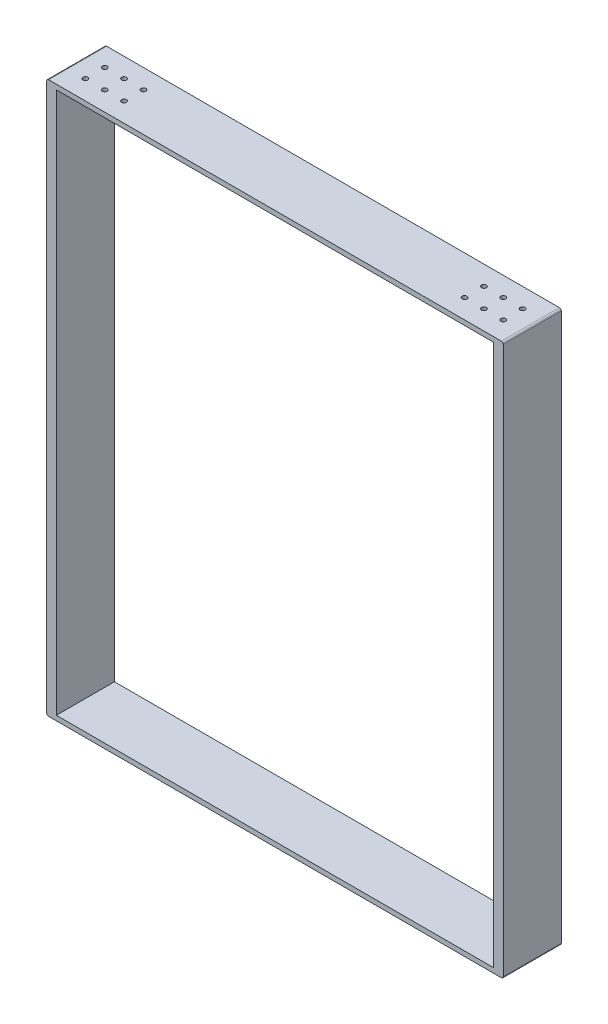
ISO-10303-21;
HEADER;
FILE_DESCRIPTION(('STEP AP214'),'2;1');
FILE_NAME('part.step','',(''),(''),'','','');
FILE_SCHEMA(('AUTOMOTIVE_DESIGN { 1 0 10303 214 1 1 1 1 }'));
ENDSEC;
DATA;
#1=APPLICATION_CONTEXT('core data for automotive mechanical design processes');
#2=APPLICATION_PROTOCOL_DEFINITION('international standard','automotive_design',2000,#1);
#3=PRODUCT_CONTEXT('',#1,'mechanical');
#4=PRODUCT('Part','Part','',(#3));
#5=PRODUCT_RELATED_PRODUCT_CATEGORY('part','',(#4));
#6=PRODUCT_DEFINITION_FORMATION('','',#4);
#7=PRODUCT_DEFINITION_CONTEXT('part definition',#1,'design');
#8=PRODUCT_DEFINITION('design','',#6,#7);
#9=PRODUCT_DEFINITION_SHAPE('','',#8);
#10=(LENGTH_UNIT() NAMED_UNIT(*) SI_UNIT(.MILLI.,.METRE.));
#11=(NAMED_UNIT(*) PLANE_ANGLE_UNIT() SI_UNIT($,.RADIAN.));
#12=(NAMED_UNIT(*) SI_UNIT($,.STERADIAN.) SOLID_ANGLE_UNIT());
#13=UNCERTAINTY_MEASURE_WITH_UNIT(LENGTH_MEASURE(1.E-05),#10,'distance_accuracy_value','');
#14=(GEOMETRIC_REPRESENTATION_CONTEXT(3) GLOBAL_UNCERTAINTY_ASSIGNED_CONTEXT((#13)) GLOBAL_UNIT_ASSIGNED_CONTEXT((#10,
#11,#12)) REPRESENTATION_CONTEXT('',''));
#15=CARTESIAN_POINT('',(0.,0.,0.));
#16=DIRECTION('',(0.,0.,1.));
#17=DIRECTION('',(1.,0.,0.));
#18=AXIS2_PLACEMENT_3D('',#15,#16,#17);
#19=CARTESIAN_POINT('',(0.,0.,76.2));
#20=DIRECTION('',(0.,0.,1.));
#21=DIRECTION('',(1.,0.,0.));
#22=AXIS2_PLACEMENT_3D('',#19,#20,#21);
#23=PLANE('',#22);
#24=DIRECTION('',(0.,-1.,0.));
#25=VECTOR('',#24,1.);
#26=CARTESIAN_POINT('',(-299.72,361.95,76.2));
#27=LINE('',#26,#25);
#28=CARTESIAN_POINT('',(-299.72,359.41,76.2));
#29=VERTEX_POINT('',#28);
#30=CARTESIAN_POINT('',(-299.72,-359.41,76.2));
#31=VERTEX_POINT('',#30);
#32=EDGE_CURVE('E198',#29,#31,#27,.T.);
#33=ORIENTED_EDGE('',*,*,#32,.T.);
#34=CARTESIAN_POINT('',(-297.18,-359.41,76.2));
#35=DIRECTION('',(0.,0.,1.));
#36=DIRECTION('',(1.,0.,0.));
#37=AXIS2_PLACEMENT_3D('',#34,#35,#36);
#38=CIRCLE('',#37,2.54);
#39=CARTESIAN_POINT('',(-297.18,-361.95,76.2));
#40=VERTEX_POINT('',#39);
#41=EDGE_CURVE('E249',#31,#40,#38,.T.);
#42=ORIENTED_EDGE('',*,*,#41,.T.);
#43=DIRECTION('',(1.,0.,0.));
#44=VECTOR('',#43,1.);
#45=CARTESIAN_POINT('',(-299.72,-361.95,76.2));
#46=LINE('',#45,#44);
#47=CARTESIAN_POINT('',(297.18,-361.95,76.2));
#48=VERTEX_POINT('',#47);
#49=EDGE_CURVE('E187',#40,#48,#46,.T.);
#50=ORIENTED_EDGE('',*,*,#49,.T.);
#51=CARTESIAN_POINT('',(297.18,-359.41,76.2));
#52=DIRECTION('',(0.,0.,1.));
#53=DIRECTION('',(1.,0.,0.));
#54=AXIS2_PLACEMENT_3D('',#51,#52,#53);
#55=CIRCLE('',#54,2.54);
#56=CARTESIAN_POINT('',(299.72,-359.41,76.2));
#57=VERTEX_POINT('',#56);
#58=EDGE_CURVE('E246',#48,#57,#55,.T.);
#59=ORIENTED_EDGE('',*,*,#58,.T.);
#60=DIRECTION('',(0.,1.,0.));
#61=VECTOR('',#60,1.);
#62=CARTESIAN_POINT('',(299.72,-361.95,76.2));
#63=LINE('',#62,#61);
#64=CARTESIAN_POINT('',(299.72,359.41,76.2));
#65=VERTEX_POINT('',#64);
#66=EDGE_CURVE('E191',#57,#65,#63,.T.);
#67=ORIENTED_EDGE('',*,*,#66,.T.);
#68=CARTESIAN_POINT('',(297.18,359.41,76.2));
#69=DIRECTION('',(0.,0.,1.));
#70=DIRECTION('',(1.,0.,0.));
#71=AXIS2_PLACEMENT_3D('',#68,#69,#70);
#72=CIRCLE('',#71,2.54);
#73=CARTESIAN_POINT('',(297.18,361.95,76.2));
#74=VERTEX_POINT('',#73);
#75=EDGE_CURVE('E62',#65,#74,#72,.T.);
#76=ORIENTED_EDGE('',*,*,#75,.T.);
#77=DIRECTION('',(-1.,0.,0.));
#78=VECTOR('',#77,1.);
#79=CARTESIAN_POINT('',(299.72,361.95,76.2));
#80=LINE('',#79,#78);
#81=CARTESIAN_POINT('',(-297.18,361.95,76.2));
#82=VERTEX_POINT('',#81);
#83=EDGE_CURVE('E195',#74,#82,#80,.T.);
#84=ORIENTED_EDGE('',*,*,#83,.T.);
#85=CARTESIAN_POINT('',(-297.18,359.41,76.2));
#86=DIRECTION('',(0.,0.,1.));
#87=DIRECTION('',(1.,0.,0.));
#88=AXIS2_PLACEMENT_3D('',#85,#86,#87);
#89=CIRCLE('',#88,2.54);
#90=EDGE_CURVE('E241',#82,#29,#89,.T.);
#91=ORIENTED_EDGE('',*,*,#90,.T.);
#92=EDGE_LOOP('',(#33,#42,#50,#59,#67,#76,#84,#91));
#93=FACE_BOUND('',#92,.T.);
#94=DIRECTION('',(0.,-1.,0.));
#95=VECTOR('',#94,1.);
#96=CARTESIAN_POINT('',(-287.02,355.6,76.2));
#97=LINE('',#96,#95);
#98=CARTESIAN_POINT('',(-287.02,355.6,76.2));
#99=VERTEX_POINT('',#98);
#100=CARTESIAN_POINT('',(-287.02,-355.6,76.2));
#101=VERTEX_POINT('',#100);
#102=EDGE_CURVE('E143',#99,#101,#97,.T.);
#103=ORIENTED_EDGE('',*,*,#102,.F.);
#104=DIRECTION('',(-1.,0.,0.));
#105=VECTOR('',#104,1.);
#106=CARTESIAN_POINT('',(287.02,355.6,76.2));
#107=LINE('',#106,#105);
#108=CARTESIAN_POINT('',(287.02,355.6,76.2));
#109=VERTEX_POINT('',#108);
#110=EDGE_CURVE('E132',#109,#99,#107,.T.);
#111=ORIENTED_EDGE('',*,*,#110,.F.);
#112=DIRECTION('',(0.,1.,0.));
#113=VECTOR('',#112,1.);
#114=CARTESIAN_POINT('',(287.02,-355.6,76.2));
#115=LINE('',#114,#113);
#116=CARTESIAN_POINT('',(287.02,-355.6,76.2));
#117=VERTEX_POINT('',#116);
#118=EDGE_CURVE('E161',#117,#109,#115,.T.);
#119=ORIENTED_EDGE('',*,*,#118,.F.);
#120=DIRECTION('',(1.,0.,0.));
#121=VECTOR('',#120,1.);
#122=CARTESIAN_POINT('',(-287.02,-355.6,76.2));
#123=LINE('',#122,#121);
#124=EDGE_CURVE('E157',#101,#117,#123,.T.);
#125=ORIENTED_EDGE('',*,*,#124,.F.);
#126=EDGE_LOOP('',(#103,#111,#119,#125));
#127=FACE_BOUND('',#126,.T.);
#128=ADVANCED_FACE('F40',(#93,#127),#23,.T.);
#129=CARTESIAN_POINT('',(0.,0.,0.));
#130=DIRECTION('',(0.,0.,1.));
#131=DIRECTION('',(1.,0.,0.));
#132=AXIS2_PLACEMENT_3D('',#129,#130,#131);
#133=PLANE('',#132);
#134=DIRECTION('',(1.,0.,0.));
#135=VECTOR('',#134,1.);
#136=CARTESIAN_POINT('',(-299.72,-361.95,0.));
#137=LINE('',#136,#135);
#138=CARTESIAN_POINT('',(-297.18,-361.95,0.));
#139=VERTEX_POINT('',#138);
#140=CARTESIAN_POINT('',(297.18,-361.95,0.));
#141=VERTEX_POINT('',#140);
#142=EDGE_CURVE('E152',#139,#141,#137,.T.);
#143=ORIENTED_EDGE('',*,*,#142,.F.);
#144=CARTESIAN_POINT('',(-297.18,-359.41,0.));
#145=DIRECTION('',(0.,0.,1.));
#146=DIRECTION('',(1.,0.,0.));
#147=AXIS2_PLACEMENT_3D('',#144,#145,#146);
#148=CIRCLE('',#147,2.54);
#149=CARTESIAN_POINT('',(-299.72,-359.41,0.));
#150=VERTEX_POINT('',#149);
#151=EDGE_CURVE('E231',#139,#150,#148,.F.);
#152=ORIENTED_EDGE('',*,*,#151,.T.);
#153=DIRECTION('',(0.,-1.,0.));
#154=VECTOR('',#153,1.);
#155=CARTESIAN_POINT('',(-299.72,361.95,0.));
#156=LINE('',#155,#154);
#157=CARTESIAN_POINT('',(-299.72,359.41,0.));
#158=VERTEX_POINT('',#157);
#159=EDGE_CURVE('E192',#158,#150,#156,.T.);
#160=ORIENTED_EDGE('',*,*,#159,.F.);
#161=CARTESIAN_POINT('',(-297.18,359.41,0.));
#162=DIRECTION('',(0.,0.,1.));
#163=DIRECTION('',(1.,0.,0.));
#164=AXIS2_PLACEMENT_3D('',#161,#162,#163);
#165=CIRCLE('',#164,2.54);
#166=CARTESIAN_POINT('',(-297.18,361.95,0.));
#167=VERTEX_POINT('',#166);
#168=EDGE_CURVE('E222',#158,#167,#165,.F.);
#169=ORIENTED_EDGE('',*,*,#168,.T.);
#170=DIRECTION('',(-1.,0.,0.));
#171=VECTOR('',#170,1.);
#172=CARTESIAN_POINT('',(299.72,361.95,0.));
#173=LINE('',#172,#171);
#174=CARTESIAN_POINT('',(297.18,361.95,0.));
#175=VERTEX_POINT('',#174);
#176=EDGE_CURVE('E210',#175,#167,#173,.T.);
#177=ORIENTED_EDGE('',*,*,#176,.F.);
#178=CARTESIAN_POINT('',(297.18,359.41,0.));
#179=DIRECTION('',(0.,0.,1.));
#180=DIRECTION('',(1.,0.,0.));
#181=AXIS2_PLACEMENT_3D('',#178,#179,#180);
#182=CIRCLE('',#181,2.54);
#183=CARTESIAN_POINT('',(299.72,359.41,0.));
#184=VERTEX_POINT('',#183);
#185=EDGE_CURVE('E225',#175,#184,#182,.F.);
#186=ORIENTED_EDGE('',*,*,#185,.T.);
#187=DIRECTION('',(0.,1.,0.));
#188=VECTOR('',#187,1.);
#189=CARTESIAN_POINT('',(299.72,-361.95,0.));
#190=LINE('',#189,#188);
#191=CARTESIAN_POINT('',(299.72,-359.41,0.));
#192=VERTEX_POINT('',#191);
#193=EDGE_CURVE('E206',#192,#184,#190,.T.);
#194=ORIENTED_EDGE('',*,*,#193,.F.);
#195=CARTESIAN_POINT('',(297.18,-359.41,0.));
#196=DIRECTION('',(0.,0.,1.));
#197=DIRECTION('',(1.,0.,0.));
#198=AXIS2_PLACEMENT_3D('',#195,#196,#197);
#199=CIRCLE('',#198,2.54);
#200=EDGE_CURVE('E228',#192,#141,#199,.F.);
#201=ORIENTED_EDGE('',*,*,#200,.T.);
#202=EDGE_LOOP('',(#143,#152,#160,#169,#177,#186,#194,#201));
#203=FACE_BOUND('',#202,.T.);
#204=DIRECTION('',(-1.,0.,0.));
#205=VECTOR('',#204,1.);
#206=CARTESIAN_POINT('',(287.02,355.6,0.));
#207=LINE('',#206,#205);
#208=CARTESIAN_POINT('',(287.02,355.6,0.));
#209=VERTEX_POINT('',#208);
#210=CARTESIAN_POINT('',(-287.02,355.6,0.));
#211=VERTEX_POINT('',#210);
#212=EDGE_CURVE('E167',#209,#211,#207,.T.);
#213=ORIENTED_EDGE('',*,*,#212,.T.);
#214=DIRECTION('',(0.,-1.,0.));
#215=VECTOR('',#214,1.);
#216=CARTESIAN_POINT('',(-287.02,355.6,0.));
#217=LINE('',#216,#215);
#218=CARTESIAN_POINT('',(-287.02,-355.6,0.));
#219=VERTEX_POINT('',#218);
#220=EDGE_CURVE('E150',#211,#219,#217,.T.);
#221=ORIENTED_EDGE('',*,*,#220,.T.);
#222=DIRECTION('',(1.,0.,0.));
#223=VECTOR('',#222,1.);
#224=CARTESIAN_POINT('',(-287.02,-355.6,0.));
#225=LINE('',#224,#223);
#226=CARTESIAN_POINT('',(287.02,-355.6,0.));
#227=VERTEX_POINT('',#226);
#228=EDGE_CURVE('E173',#219,#227,#225,.T.);
#229=ORIENTED_EDGE('',*,*,#228,.T.);
#230=DIRECTION('',(0.,1.,0.));
#231=VECTOR('',#230,1.);
#232=CARTESIAN_POINT('',(287.02,-355.6,0.));
#233=LINE('',#232,#231);
#234=EDGE_CURVE('E144',#227,#209,#233,.T.);
#235=ORIENTED_EDGE('',*,*,#234,.T.);
#236=EDGE_LOOP('',(#213,#221,#229,#235));
#237=FACE_BOUND('',#236,.T.);
#238=ADVANCED_FACE('F269',(#203,#237),#133,.F.);
#239=CARTESIAN_POINT('',(-299.72,-361.95,76.2));
#240=DIRECTION('',(0.,1.,0.));
#241=DIRECTION('',(-1.,0.,0.));
#242=AXIS2_PLACEMENT_3D('',#239,#240,#241);
#243=PLANE('',#242);
#244=ORIENTED_EDGE('',*,*,#49,.F.);
#245=DIRECTION('',(0.,0.,-1.));
#246=VECTOR('',#245,1.);
#247=CARTESIAN_POINT('',(-297.18,-361.95,76.2));
#248=LINE('',#247,#246);
#249=EDGE_CURVE('E218',#40,#139,#248,.T.);
#250=ORIENTED_EDGE('',*,*,#249,.T.);
#251=ORIENTED_EDGE('',*,*,#142,.T.);
#252=DIRECTION('',(0.,0.,-1.));
#253=VECTOR('',#252,1.);
#254=CARTESIAN_POINT('',(297.18,-361.95,76.2));
#255=LINE('',#254,#253);
#256=EDGE_CURVE('E202',#141,#48,#255,.F.);
#257=ORIENTED_EDGE('',*,*,#256,.T.);
#258=EDGE_LOOP('',(#244,#250,#251,#257));
#259=FACE_BOUND('',#258,.T.);
#260=ADVANCED_FACE('F290',(#259),#243,.F.);
#261=CARTESIAN_POINT('',(299.72,-361.95,76.2));
#262=DIRECTION('',(-1.,0.,0.));
#263=DIRECTION('',(0.,0.,1.));
#264=AXIS2_PLACEMENT_3D('',#261,#262,#263);
#265=PLANE('',#264);
#266=ORIENTED_EDGE('',*,*,#66,.F.);
#267=DIRECTION('',(0.,0.,-1.));
#268=VECTOR('',#267,1.);
#269=CARTESIAN_POINT('',(299.72,-359.41,76.2));
#270=LINE('',#269,#268);
#271=EDGE_CURVE('E255',#57,#192,#270,.T.);
#272=ORIENTED_EDGE('',*,*,#271,.T.);
#273=ORIENTED_EDGE('',*,*,#193,.T.);
#274=DIRECTION('',(0.,0.,-1.));
#275=VECTOR('',#274,1.);
#276=CARTESIAN_POINT('',(299.72,359.41,76.2));
#277=LINE('',#276,#275);
#278=EDGE_CURVE('E252',#184,#65,#277,.F.);
#279=ORIENTED_EDGE('',*,*,#278,.T.);
#280=EDGE_LOOP('',(#266,#272,#273,#279));
#281=FACE_BOUND('',#280,.T.);
#282=ADVANCED_FACE('F263',(#281),#265,.F.);
#283=CARTESIAN_POINT('',(299.72,361.95,76.2));
#284=DIRECTION('',(0.,-1.,0.));
#285=DIRECTION('',(0.,0.,-1.));
#286=AXIS2_PLACEMENT_3D('',#283,#284,#285);
#287=PLANE('',#286);
#288=CARTESIAN_POINT('',(223.52,361.95,50.8));
#289=DIRECTION('',(0.,-1.,0.));
#290=DIRECTION('',(0.,0.,1.));
#291=AXIS2_PLACEMENT_3D('',#288,#289,#290);
#292=CIRCLE('',#291,3.17499999999997);
#293=CARTESIAN_POINT('',(223.52,361.95,53.975));
#294=VERTEX_POINT('',#293);
#295=EDGE_CURVE('E535',#294,#294,#292,.T.);
#296=ORIENTED_EDGE('',*,*,#295,.T.);
#297=EDGE_LOOP('',(#296));
#298=FACE_BOUND('',#297,.T.);
#299=CARTESIAN_POINT('',(248.92,361.95,25.4));
#300=DIRECTION('',(0.,-1.,0.));
#301=DIRECTION('',(0.,0.,1.));
#302=AXIS2_PLACEMENT_3D('',#299,#300,#301);
#303=CIRCLE('',#302,3.17499999999997);
#304=CARTESIAN_POINT('',(248.92,361.95,28.575));
#305=VERTEX_POINT('',#304);
#306=EDGE_CURVE('E541',#305,#305,#303,.T.);
#307=ORIENTED_EDGE('',*,*,#306,.T.);
#308=EDGE_LOOP('',(#307));
#309=FACE_BOUND('',#308,.T.);
#310=CARTESIAN_POINT('',(248.92,361.95,50.8));
#311=DIRECTION('',(0.,-1.,0.));
#312=DIRECTION('',(0.,0.,1.));
#313=AXIS2_PLACEMENT_3D('',#310,#311,#312);
#314=CIRCLE('',#313,3.17499999999997);
#315=CARTESIAN_POINT('',(248.92,361.95,53.975));
#316=VERTEX_POINT('',#315);
#317=EDGE_CURVE('E560',#316,#316,#314,.T.);
#318=ORIENTED_EDGE('',*,*,#317,.T.);
#319=EDGE_LOOP('',(#318));
#320=FACE_BOUND('',#319,.T.);
#321=CARTESIAN_POINT('',(274.32,361.95,25.4));
#322=DIRECTION('',(0.,-1.,0.));
#323=DIRECTION('',(0.,0.,1.));
#324=AXIS2_PLACEMENT_3D('',#321,#322,#323);
#325=CIRCLE('',#324,3.17499999999997);
#326=CARTESIAN_POINT('',(274.32,361.95,28.575));
#327=VERTEX_POINT('',#326);
#328=EDGE_CURVE('E550',#327,#327,#325,.T.);
#329=ORIENTED_EDGE('',*,*,#328,.T.);
#330=EDGE_LOOP('',(#329));
#331=FACE_BOUND('',#330,.T.);
#332=CARTESIAN_POINT('',(223.52,361.95,25.4));
#333=DIRECTION('',(0.,-1.,0.));
#334=DIRECTION('',(0.,0.,1.));
#335=AXIS2_PLACEMENT_3D('',#332,#333,#334);
#336=CIRCLE('',#335,3.17499999999997);
#337=CARTESIAN_POINT('',(223.52,361.95,28.575));
#338=VERTEX_POINT('',#337);
#339=EDGE_CURVE('E544',#338,#338,#336,.T.);
#340=ORIENTED_EDGE('',*,*,#339,.T.);
#341=EDGE_LOOP('',(#340));
#342=FACE_BOUND('',#341,.T.);
#343=CARTESIAN_POINT('',(274.32,361.95,50.8));
#344=DIRECTION('',(0.,-1.,0.));
#345=DIRECTION('',(0.,0.,1.));
#346=AXIS2_PLACEMENT_3D('',#343,#344,#345);
#347=CIRCLE('',#346,3.17499999999997);
#348=CARTESIAN_POINT('',(274.32,361.95,53.975));
#349=VERTEX_POINT('',#348);
#350=EDGE_CURVE('E559',#349,#349,#347,.T.);
#351=ORIENTED_EDGE('',*,*,#350,.T.);
#352=EDGE_LOOP('',(#351));
#353=FACE_BOUND('',#352,.T.);
#354=CARTESIAN_POINT('',(-223.52,361.95,50.8));
#355=DIRECTION('',(0.,1.,0.));
#356=DIRECTION('',(0.,0.,1.));
#357=AXIS2_PLACEMENT_3D('',#354,#355,#356);
#358=CIRCLE('',#357,3.17499999999997);
#359=CARTESIAN_POINT('',(-223.52,361.95,53.975));
#360=VERTEX_POINT('',#359);
#361=EDGE_CURVE('E588',#360,#360,#358,.T.);
#362=ORIENTED_EDGE('',*,*,#361,.F.);
#363=EDGE_LOOP('',(#362));
#364=FACE_BOUND('',#363,.T.);
#365=CARTESIAN_POINT('',(-248.92,361.95,25.4));
#366=DIRECTION('',(0.,1.,0.));
#367=DIRECTION('',(0.,0.,1.));
#368=AXIS2_PLACEMENT_3D('',#365,#366,#367);
#369=CIRCLE('',#368,3.17499999999997);
#370=CARTESIAN_POINT('',(-248.92,361.95,28.575));
#371=VERTEX_POINT('',#370);
#372=EDGE_CURVE('E587',#371,#371,#369,.T.);
#373=ORIENTED_EDGE('',*,*,#372,.F.);
#374=EDGE_LOOP('',(#373));
#375=FACE_BOUND('',#374,.T.);
#376=CARTESIAN_POINT('',(-248.92,361.95,50.8));
#377=DIRECTION('',(0.,1.,0.));
#378=DIRECTION('',(0.,0.,1.));
#379=AXIS2_PLACEMENT_3D('',#376,#377,#378);
#380=CIRCLE('',#379,3.17499999999997);
#381=CARTESIAN_POINT('',(-248.92,361.95,53.975));
#382=VERTEX_POINT('',#381);
#383=EDGE_CURVE('E604',#382,#382,#380,.T.);
#384=ORIENTED_EDGE('',*,*,#383,.F.);
#385=EDGE_LOOP('',(#384));
#386=FACE_BOUND('',#385,.T.);
#387=CARTESIAN_POINT('',(-274.32,361.95,25.4));
#388=DIRECTION('',(0.,1.,0.));
#389=DIRECTION('',(0.,0.,1.));
#390=AXIS2_PLACEMENT_3D('',#387,#388,#389);
#391=CIRCLE('',#390,3.17499999999997);
#392=CARTESIAN_POINT('',(-274.32,361.95,28.575));
#393=VERTEX_POINT('',#392);
#394=EDGE_CURVE('E603',#393,#393,#391,.T.);
#395=ORIENTED_EDGE('',*,*,#394,.F.);
#396=EDGE_LOOP('',(#395));
#397=FACE_BOUND('',#396,.T.);
#398=CARTESIAN_POINT('',(-223.52,361.95,25.4));
#399=DIRECTION('',(0.,1.,0.));
#400=DIRECTION('',(0.,0.,1.));
#401=AXIS2_PLACEMENT_3D('',#398,#399,#400);
#402=CIRCLE('',#401,3.17499999999997);
#403=CARTESIAN_POINT('',(-223.52,361.95,28.575));
#404=VERTEX_POINT('',#403);
#405=EDGE_CURVE('E578',#404,#404,#402,.T.);
#406=ORIENTED_EDGE('',*,*,#405,.F.);
#407=EDGE_LOOP('',(#406));
#408=FACE_BOUND('',#407,.T.);
#409=CARTESIAN_POINT('',(-274.32,361.95,50.8));
#410=DIRECTION('',(0.,1.,0.));
#411=DIRECTION('',(0.,0.,1.));
#412=AXIS2_PLACEMENT_3D('',#409,#410,#411);
#413=CIRCLE('',#412,3.17499999999997);
#414=CARTESIAN_POINT('',(-274.32,361.95,53.975));
#415=VERTEX_POINT('',#414);
#416=EDGE_CURVE('E170',#415,#415,#413,.T.);
#417=ORIENTED_EDGE('',*,*,#416,.F.);
#418=EDGE_LOOP('',(#417));
#419=FACE_BOUND('',#418,.T.);
#420=ORIENTED_EDGE('',*,*,#83,.F.);
#421=DIRECTION('',(0.,0.,-1.));
#422=VECTOR('',#421,1.);
#423=CARTESIAN_POINT('',(297.18,361.95,76.2));
#424=LINE('',#423,#422);
#425=EDGE_CURVE('E11',#74,#175,#424,.T.);
#426=ORIENTED_EDGE('',*,*,#425,.T.);
#427=ORIENTED_EDGE('',*,*,#176,.T.);
#428=DIRECTION('',(0.,0.,-1.));
#429=VECTOR('',#428,1.);
#430=CARTESIAN_POINT('',(-297.18,361.95,76.2));
#431=LINE('',#430,#429);
#432=EDGE_CURVE('E49',#167,#82,#431,.F.);
#433=ORIENTED_EDGE('',*,*,#432,.T.);
#434=EDGE_LOOP('',(#420,#426,#427,#433));
#435=FACE_BOUND('',#434,.T.);
#436=ADVANCED_FACE('F275',(#298,#309,#320,#331,#342,#353,#364,#375,#386,#397,#408,#419,#435),
#287,.F.);
#437=CARTESIAN_POINT('',(-299.72,361.95,76.2));
#438=DIRECTION('',(1.,0.,0.));
#439=DIRECTION('',(0.,1.,0.));
#440=AXIS2_PLACEMENT_3D('',#437,#438,#439);
#441=PLANE('',#440);
#442=ORIENTED_EDGE('',*,*,#159,.T.);
#443=DIRECTION('',(0.,0.,-1.));
#444=VECTOR('',#443,1.);
#445=CARTESIAN_POINT('',(-299.72,-359.41,76.2));
#446=LINE('',#445,#444);
#447=EDGE_CURVE('E238',#150,#31,#446,.F.);
#448=ORIENTED_EDGE('',*,*,#447,.T.);
#449=ORIENTED_EDGE('',*,*,#32,.F.);
#450=DIRECTION('',(0.,0.,-1.));
#451=VECTOR('',#450,1.);
#452=CARTESIAN_POINT('',(-299.72,359.41,76.2));
#453=LINE('',#452,#451);
#454=EDGE_CURVE('E234',#29,#158,#453,.T.);
#455=ORIENTED_EDGE('',*,*,#454,.T.);
#456=EDGE_LOOP('',(#442,#448,#449,#455));
#457=FACE_BOUND('',#456,.T.);
#458=ADVANCED_FACE('F282',(#457),#441,.F.);
#459=CARTESIAN_POINT('',(287.02,355.6,76.2));
#460=DIRECTION('',(0.,-1.,0.));
#461=DIRECTION('',(1.,0.,0.));
#462=AXIS2_PLACEMENT_3D('',#459,#460,#461);
#463=PLANE('',#462);
#464=CARTESIAN_POINT('',(223.52,355.6,50.8));
#465=DIRECTION('',(0.,-1.,0.));
#466=DIRECTION('',(1.,0.,0.));
#467=AXIS2_PLACEMENT_3D('',#464,#465,#466);
#468=CIRCLE('',#467,3.17499999999997);
#469=CARTESIAN_POINT('',(226.695,355.6,50.8));
#470=VERTEX_POINT('',#469);
#471=EDGE_CURVE('E532',#470,#470,#468,.T.);
#472=ORIENTED_EDGE('',*,*,#471,.F.);
#473=EDGE_LOOP('',(#472));
#474=FACE_BOUND('',#473,.T.);
#475=CARTESIAN_POINT('',(248.92,355.6,25.4));
#476=DIRECTION('',(0.,-1.,0.));
#477=DIRECTION('',(1.,0.,0.));
#478=AXIS2_PLACEMENT_3D('',#475,#476,#477);
#479=CIRCLE('',#478,3.17499999999997);
#480=CARTESIAN_POINT('',(252.095,355.6,25.4));
#481=VERTEX_POINT('',#480);
#482=EDGE_CURVE('E547',#481,#481,#479,.T.);
#483=ORIENTED_EDGE('',*,*,#482,.F.);
#484=EDGE_LOOP('',(#483));
#485=FACE_BOUND('',#484,.T.);
#486=CARTESIAN_POINT('',(248.92,355.6,50.8));
#487=DIRECTION('',(0.,-1.,0.));
#488=DIRECTION('',(1.,0.,0.));
#489=AXIS2_PLACEMENT_3D('',#486,#487,#488);
#490=CIRCLE('',#489,3.17499999999997);
#491=CARTESIAN_POINT('',(252.095,355.6,50.8));
#492=VERTEX_POINT('',#491);
#493=EDGE_CURVE('E555',#492,#492,#490,.T.);
#494=ORIENTED_EDGE('',*,*,#493,.F.);
#495=EDGE_LOOP('',(#494));
#496=FACE_BOUND('',#495,.T.);
#497=CARTESIAN_POINT('',(274.32,355.6,25.4));
#498=DIRECTION('',(0.,-1.,0.));
#499=DIRECTION('',(1.,0.,0.));
#500=AXIS2_PLACEMENT_3D('',#497,#498,#499);
#501=CIRCLE('',#500,3.17499999999997);
#502=CARTESIAN_POINT('',(277.495,355.6,25.4));
#503=VERTEX_POINT('',#502);
#504=EDGE_CURVE('E554',#503,#503,#501,.T.);
#505=ORIENTED_EDGE('',*,*,#504,.F.);
#506=EDGE_LOOP('',(#505));
#507=FACE_BOUND('',#506,.T.);
#508=CARTESIAN_POINT('',(223.52,355.6,25.4));
#509=DIRECTION('',(0.,-1.,0.));
#510=DIRECTION('',(1.,0.,0.));
#511=AXIS2_PLACEMENT_3D('',#508,#509,#510);
#512=CIRCLE('',#511,3.17499999999997);
#513=CARTESIAN_POINT('',(226.695,355.6,25.4));
#514=VERTEX_POINT('',#513);
#515=EDGE_CURVE('E537',#514,#514,#512,.T.);
#516=ORIENTED_EDGE('',*,*,#515,.F.);
#517=EDGE_LOOP('',(#516));
#518=FACE_BOUND('',#517,.T.);
#519=CARTESIAN_POINT('',(274.32,355.6,50.8));
#520=DIRECTION('',(0.,-1.,0.));
#521=DIRECTION('',(1.,0.,0.));
#522=AXIS2_PLACEMENT_3D('',#519,#520,#521);
#523=CIRCLE('',#522,3.17499999999997);
#524=CARTESIAN_POINT('',(277.495,355.6,50.8));
#525=VERTEX_POINT('',#524);
#526=EDGE_CURVE('E570',#525,#525,#523,.T.);
#527=ORIENTED_EDGE('',*,*,#526,.F.);
#528=EDGE_LOOP('',(#527));
#529=FACE_BOUND('',#528,.T.);
#530=CARTESIAN_POINT('',(-223.52,355.6,50.8));
#531=DIRECTION('',(0.,-1.,0.));
#532=DIRECTION('',(1.,0.,0.));
#533=AXIS2_PLACEMENT_3D('',#530,#531,#532);
#534=CIRCLE('',#533,3.17499999999997);
#535=CARTESIAN_POINT('',(-220.345,355.6,50.8));
#536=VERTEX_POINT('',#535);
#537=EDGE_CURVE('E582',#536,#536,#534,.F.);
#538=ORIENTED_EDGE('',*,*,#537,.T.);
#539=EDGE_LOOP('',(#538));
#540=FACE_BOUND('',#539,.T.);
#541=CARTESIAN_POINT('',(-248.92,355.6,25.4));
#542=DIRECTION('',(0.,-1.,0.));
#543=DIRECTION('',(1.,0.,0.));
#544=AXIS2_PLACEMENT_3D('',#541,#542,#543);
#545=CIRCLE('',#544,3.17499999999997);
#546=CARTESIAN_POINT('',(-245.745,355.6,25.4));
#547=VERTEX_POINT('',#546);
#548=EDGE_CURVE('E583',#547,#547,#545,.F.);
#549=ORIENTED_EDGE('',*,*,#548,.T.);
#550=EDGE_LOOP('',(#549));
#551=FACE_BOUND('',#550,.T.);
#552=CARTESIAN_POINT('',(-248.92,355.6,50.8));
#553=DIRECTION('',(0.,-1.,0.));
#554=DIRECTION('',(1.,0.,0.));
#555=AXIS2_PLACEMENT_3D('',#552,#553,#554);
#556=CIRCLE('',#555,3.17499999999997);
#557=CARTESIAN_POINT('',(-245.745,355.6,50.8));
#558=VERTEX_POINT('',#557);
#559=EDGE_CURVE('E592',#558,#558,#556,.F.);
#560=ORIENTED_EDGE('',*,*,#559,.T.);
#561=EDGE_LOOP('',(#560));
#562=FACE_BOUND('',#561,.T.);
#563=CARTESIAN_POINT('',(-274.32,355.6,25.4));
#564=DIRECTION('',(0.,-1.,0.));
#565=DIRECTION('',(1.,0.,0.));
#566=AXIS2_PLACEMENT_3D('',#563,#564,#565);
#567=CIRCLE('',#566,3.17499999999997);
#568=CARTESIAN_POINT('',(-271.145,355.6,25.4));
#569=VERTEX_POINT('',#568);
#570=EDGE_CURVE('E599',#569,#569,#567,.F.);
#571=ORIENTED_EDGE('',*,*,#570,.T.);
#572=EDGE_LOOP('',(#571));
#573=FACE_BOUND('',#572,.T.);
#574=CARTESIAN_POINT('',(-223.52,355.6,25.4));
#575=DIRECTION('',(0.,-1.,0.));
#576=DIRECTION('',(1.,0.,0.));
#577=AXIS2_PLACEMENT_3D('',#574,#575,#576);
#578=CIRCLE('',#577,3.17499999999997);
#579=CARTESIAN_POINT('',(-220.345,355.6,25.4));
#580=VERTEX_POINT('',#579);
#581=EDGE_CURVE('E574',#580,#580,#578,.F.);
#582=ORIENTED_EDGE('',*,*,#581,.T.);
#583=EDGE_LOOP('',(#582));
#584=FACE_BOUND('',#583,.T.);
#585=CARTESIAN_POINT('',(-274.32,355.6,50.8));
#586=DIRECTION('',(0.,-1.,0.));
#587=DIRECTION('',(1.,0.,0.));
#588=AXIS2_PLACEMENT_3D('',#585,#586,#587);
#589=CIRCLE('',#588,3.17499999999997);
#590=CARTESIAN_POINT('',(-271.145,355.6,50.8));
#591=VERTEX_POINT('',#590);
#592=EDGE_CURVE('E608',#591,#591,#589,.F.);
#593=ORIENTED_EDGE('',*,*,#592,.T.);
#594=EDGE_LOOP('',(#593));
#595=FACE_BOUND('',#594,.T.);
#596=ORIENTED_EDGE('',*,*,#212,.F.);
#597=DIRECTION('',(0.,0.,-1.));
#598=VECTOR('',#597,1.);
#599=CARTESIAN_POINT('',(287.02,355.6,76.2));
#600=LINE('',#599,#598);
#601=EDGE_CURVE('E138',#109,#209,#600,.T.);
#602=ORIENTED_EDGE('',*,*,#601,.F.);
#603=ORIENTED_EDGE('',*,*,#110,.T.);
#604=DIRECTION('',(0.,0.,-1.));
#605=VECTOR('',#604,1.);
#606=CARTESIAN_POINT('',(-287.02,355.6,76.2));
#607=LINE('',#606,#605);
#608=EDGE_CURVE('E135',#99,#211,#607,.T.);
#609=ORIENTED_EDGE('',*,*,#608,.T.);
#610=EDGE_LOOP('',(#596,#602,#603,#609));
#611=FACE_BOUND('',#610,.T.);
#612=ADVANCED_FACE('F134',(#474,#485,#496,#507,#518,#529,#540,#551,#562,#573,#584,#595,#611),
#463,.T.);
#613=CARTESIAN_POINT('',(-287.02,355.6,76.2));
#614=DIRECTION('',(1.,0.,0.));
#615=DIRECTION('',(0.,0.,-1.));
#616=AXIS2_PLACEMENT_3D('',#613,#614,#615);
#617=PLANE('',#616);
#618=ORIENTED_EDGE('',*,*,#220,.F.);
#619=ORIENTED_EDGE('',*,*,#608,.F.);
#620=ORIENTED_EDGE('',*,*,#102,.T.);
#621=DIRECTION('',(0.,0.,-1.));
#622=VECTOR('',#621,1.);
#623=CARTESIAN_POINT('',(-287.02,-355.6,76.2));
#624=LINE('',#623,#622);
#625=EDGE_CURVE('E153',#101,#219,#624,.T.);
#626=ORIENTED_EDGE('',*,*,#625,.T.);
#627=EDGE_LOOP('',(#618,#619,#620,#626));
#628=FACE_BOUND('',#627,.T.);
#629=ADVANCED_FACE('F147',(#628),#617,.T.);
#630=CARTESIAN_POINT('',(-287.02,-355.6,76.2));
#631=DIRECTION('',(0.,1.,0.));
#632=DIRECTION('',(-1.,0.,0.));
#633=AXIS2_PLACEMENT_3D('',#630,#631,#632);
#634=PLANE('',#633);
#635=ORIENTED_EDGE('',*,*,#228,.F.);
#636=ORIENTED_EDGE('',*,*,#625,.F.);
#637=ORIENTED_EDGE('',*,*,#124,.T.);
#638=DIRECTION('',(0.,0.,-1.));
#639=VECTOR('',#638,1.);
#640=CARTESIAN_POINT('',(287.02,-355.6,76.2));
#641=LINE('',#640,#639);
#642=EDGE_CURVE('E182',#117,#227,#641,.T.);
#643=ORIENTED_EDGE('',*,*,#642,.T.);
#644=EDGE_LOOP('',(#635,#636,#637,#643));
#645=FACE_BOUND('',#644,.T.);
#646=ADVANCED_FACE('F349',(#645),#634,.T.);
#647=CARTESIAN_POINT('',(287.02,-355.6,76.2));
#648=DIRECTION('',(-1.,0.,0.));
#649=DIRECTION('',(0.,-1.,0.));
#650=AXIS2_PLACEMENT_3D('',#647,#648,#649);
#651=PLANE('',#650);
#652=ORIENTED_EDGE('',*,*,#234,.F.);
#653=ORIENTED_EDGE('',*,*,#642,.F.);
#654=ORIENTED_EDGE('',*,*,#118,.T.);
#655=ORIENTED_EDGE('',*,*,#601,.T.);
#656=EDGE_LOOP('',(#652,#653,#654,#655));
#657=FACE_BOUND('',#656,.T.);
#658=ADVANCED_FACE('F355',(#657),#651,.T.);
#659=CARTESIAN_POINT('',(-274.32,-361.951,50.8));
#660=DIRECTION('',(0.,1.,0.));
#661=DIRECTION('',(0.,0.,1.));
#662=AXIS2_PLACEMENT_3D('',#659,#660,#661);
#663=CYLINDRICAL_SURFACE('',#662,3.17499999999997);
#664=ORIENTED_EDGE('',*,*,#592,.F.);
#665=EDGE_LOOP('',(#664));
#666=FACE_BOUND('',#665,.T.);
#667=ORIENTED_EDGE('',*,*,#416,.T.);
#668=EDGE_LOOP('',(#667));
#669=FACE_BOUND('',#668,.T.);
#670=ADVANCED_FACE('F363',(#666,#669),#663,.F.);
#671=CARTESIAN_POINT('',(-223.52,-361.951,25.4));
#672=DIRECTION('',(0.,1.,0.));
#673=DIRECTION('',(0.,0.,1.));
#674=AXIS2_PLACEMENT_3D('',#671,#672,#673);
#675=CYLINDRICAL_SURFACE('',#674,3.17499999999997);
#676=ORIENTED_EDGE('',*,*,#581,.F.);
#677=EDGE_LOOP('',(#676));
#678=FACE_BOUND('',#677,.T.);
#679=ORIENTED_EDGE('',*,*,#405,.T.);
#680=EDGE_LOOP('',(#679));
#681=FACE_BOUND('',#680,.T.);
#682=ADVANCED_FACE('F371',(#678,#681),#675,.F.);
#683=CARTESIAN_POINT('',(-274.32,-361.951,25.4));
#684=DIRECTION('',(0.,1.,0.));
#685=DIRECTION('',(0.,0.,1.));
#686=AXIS2_PLACEMENT_3D('',#683,#684,#685);
#687=CYLINDRICAL_SURFACE('',#686,3.17499999999997);
#688=ORIENTED_EDGE('',*,*,#570,.F.);
#689=EDGE_LOOP('',(#688));
#690=FACE_BOUND('',#689,.T.);
#691=ORIENTED_EDGE('',*,*,#394,.T.);
#692=EDGE_LOOP('',(#691));
#693=FACE_BOUND('',#692,.T.);
#694=ADVANCED_FACE('F379',(#690,#693),#687,.F.);
#695=CARTESIAN_POINT('',(-248.92,-361.951,50.8));
#696=DIRECTION('',(0.,1.,0.));
#697=DIRECTION('',(0.,0.,1.));
#698=AXIS2_PLACEMENT_3D('',#695,#696,#697);
#699=CYLINDRICAL_SURFACE('',#698,3.17499999999997);
#700=ORIENTED_EDGE('',*,*,#559,.F.);
#701=EDGE_LOOP('',(#700));
#702=FACE_BOUND('',#701,.T.);
#703=ORIENTED_EDGE('',*,*,#383,.T.);
#704=EDGE_LOOP('',(#703));
#705=FACE_BOUND('',#704,.T.);
#706=ADVANCED_FACE('F387',(#702,#705),#699,.F.);
#707=CARTESIAN_POINT('',(-248.92,-361.951,25.4));
#708=DIRECTION('',(0.,1.,0.));
#709=DIRECTION('',(0.,0.,1.));
#710=AXIS2_PLACEMENT_3D('',#707,#708,#709);
#711=CYLINDRICAL_SURFACE('',#710,3.17499999999997);
#712=ORIENTED_EDGE('',*,*,#548,.F.);
#713=EDGE_LOOP('',(#712));
#714=FACE_BOUND('',#713,.T.);
#715=ORIENTED_EDGE('',*,*,#372,.T.);
#716=EDGE_LOOP('',(#715));
#717=FACE_BOUND('',#716,.T.);
#718=ADVANCED_FACE('F395',(#714,#717),#711,.F.);
#719=CARTESIAN_POINT('',(-223.52,-361.951,50.8));
#720=DIRECTION('',(0.,1.,0.));
#721=DIRECTION('',(0.,0.,1.));
#722=AXIS2_PLACEMENT_3D('',#719,#720,#721);
#723=CYLINDRICAL_SURFACE('',#722,3.17499999999997);
#724=ORIENTED_EDGE('',*,*,#537,.F.);
#725=EDGE_LOOP('',(#724));
#726=FACE_BOUND('',#725,.T.);
#727=ORIENTED_EDGE('',*,*,#361,.T.);
#728=EDGE_LOOP('',(#727));
#729=FACE_BOUND('',#728,.T.);
#730=ADVANCED_FACE('F403',(#726,#729),#723,.F.);
#731=CARTESIAN_POINT('',(274.32,-361.951,50.8));
#732=DIRECTION('',(0.,1.,0.));
#733=DIRECTION('',(0.,0.,1.));
#734=AXIS2_PLACEMENT_3D('',#731,#732,#733);
#735=CYLINDRICAL_SURFACE('',#734,3.17499999999997);
#736=ORIENTED_EDGE('',*,*,#526,.T.);
#737=EDGE_LOOP('',(#736));
#738=FACE_BOUND('',#737,.T.);
#739=ORIENTED_EDGE('',*,*,#350,.F.);
#740=EDGE_LOOP('',(#739));
#741=FACE_BOUND('',#740,.T.);
#742=ADVANCED_FACE('F410',(#738,#741),#735,.F.);
#743=CARTESIAN_POINT('',(223.52,-361.951,25.4));
#744=DIRECTION('',(0.,1.,0.));
#745=DIRECTION('',(0.,0.,1.));
#746=AXIS2_PLACEMENT_3D('',#743,#744,#745);
#747=CYLINDRICAL_SURFACE('',#746,3.17499999999997);
#748=ORIENTED_EDGE('',*,*,#515,.T.);
#749=EDGE_LOOP('',(#748));
#750=FACE_BOUND('',#749,.T.);
#751=ORIENTED_EDGE('',*,*,#339,.F.);
#752=EDGE_LOOP('',(#751));
#753=FACE_BOUND('',#752,.T.);
#754=ADVANCED_FACE('F417',(#750,#753),#747,.F.);
#755=CARTESIAN_POINT('',(274.32,-361.951,25.4));
#756=DIRECTION('',(0.,1.,0.));
#757=DIRECTION('',(0.,0.,1.));
#758=AXIS2_PLACEMENT_3D('',#755,#756,#757);
#759=CYLINDRICAL_SURFACE('',#758,3.17499999999997);
#760=ORIENTED_EDGE('',*,*,#504,.T.);
#761=EDGE_LOOP('',(#760));
#762=FACE_BOUND('',#761,.T.);
#763=ORIENTED_EDGE('',*,*,#328,.F.);
#764=EDGE_LOOP('',(#763));
#765=FACE_BOUND('',#764,.T.);
#766=ADVANCED_FACE('F425',(#762,#765),#759,.F.);
#767=CARTESIAN_POINT('',(248.92,-361.951,50.8));
#768=DIRECTION('',(0.,1.,0.));
#769=DIRECTION('',(0.,0.,1.));
#770=AXIS2_PLACEMENT_3D('',#767,#768,#769);
#771=CYLINDRICAL_SURFACE('',#770,3.17499999999997);
#772=ORIENTED_EDGE('',*,*,#493,.T.);
#773=EDGE_LOOP('',(#772));
#774=FACE_BOUND('',#773,.T.);
#775=ORIENTED_EDGE('',*,*,#317,.F.);
#776=EDGE_LOOP('',(#775));
#777=FACE_BOUND('',#776,.T.);
#778=ADVANCED_FACE('F433',(#774,#777),#771,.F.);
#779=CARTESIAN_POINT('',(248.92,-361.951,25.4));
#780=DIRECTION('',(0.,1.,0.));
#781=DIRECTION('',(0.,0.,1.));
#782=AXIS2_PLACEMENT_3D('',#779,#780,#781);
#783=CYLINDRICAL_SURFACE('',#782,3.17499999999997);
#784=ORIENTED_EDGE('',*,*,#482,.T.);
#785=EDGE_LOOP('',(#784));
#786=FACE_BOUND('',#785,.T.);
#787=ORIENTED_EDGE('',*,*,#306,.F.);
#788=EDGE_LOOP('',(#787));
#789=FACE_BOUND('',#788,.T.);
#790=ADVANCED_FACE('F441',(#786,#789),#783,.F.);
#791=CARTESIAN_POINT('',(223.52,-361.951,50.8));
#792=DIRECTION('',(0.,1.,0.));
#793=DIRECTION('',(0.,0.,1.));
#794=AXIS2_PLACEMENT_3D('',#791,#792,#793);
#795=CYLINDRICAL_SURFACE('',#794,3.17499999999997);
#796=ORIENTED_EDGE('',*,*,#471,.T.);
#797=EDGE_LOOP('',(#796));
#798=FACE_BOUND('',#797,.T.);
#799=ORIENTED_EDGE('',*,*,#295,.F.);
#800=EDGE_LOOP('',(#799));
#801=FACE_BOUND('',#800,.T.);
#802=ADVANCED_FACE('F299',(#798,#801),#795,.F.);
#803=CARTESIAN_POINT('',(-297.18,-359.41,76.2));
#804=DIRECTION('',(0.,0.,-1.));
#805=DIRECTION('',(-1.,0.,0.));
#806=AXIS2_PLACEMENT_3D('',#803,#804,#805);
#807=CYLINDRICAL_SURFACE('',#806,2.54);
#808=ORIENTED_EDGE('',*,*,#41,.F.);
#809=ORIENTED_EDGE('',*,*,#447,.F.);
#810=ORIENTED_EDGE('',*,*,#151,.F.);
#811=ORIENTED_EDGE('',*,*,#249,.F.);
#812=EDGE_LOOP('',(#808,#809,#810,#811));
#813=FACE_BOUND('',#812,.T.);
#814=ADVANCED_FACE('F287',(#813),#807,.T.);
#815=CARTESIAN_POINT('',(297.18,-359.41,76.2));
#816=DIRECTION('',(0.,0.,-1.));
#817=DIRECTION('',(-1.,0.,0.));
#818=AXIS2_PLACEMENT_3D('',#815,#816,#817);
#819=CYLINDRICAL_SURFACE('',#818,2.54);
#820=ORIENTED_EDGE('',*,*,#58,.F.);
#821=ORIENTED_EDGE('',*,*,#256,.F.);
#822=ORIENTED_EDGE('',*,*,#200,.F.);
#823=ORIENTED_EDGE('',*,*,#271,.F.);
#824=EDGE_LOOP('',(#820,#821,#822,#823));
#825=FACE_BOUND('',#824,.T.);
#826=ADVANCED_FACE('F292',(#825),#819,.T.);
#827=CARTESIAN_POINT('',(297.18,359.41,76.2));
#828=DIRECTION('',(0.,0.,-1.));
#829=DIRECTION('',(-1.,0.,0.));
#830=AXIS2_PLACEMENT_3D('',#827,#828,#829);
#831=CYLINDRICAL_SURFACE('',#830,2.54);
#832=ORIENTED_EDGE('',*,*,#75,.F.);
#833=ORIENTED_EDGE('',*,*,#278,.F.);
#834=ORIENTED_EDGE('',*,*,#185,.F.);
#835=ORIENTED_EDGE('',*,*,#425,.F.);
#836=EDGE_LOOP('',(#832,#833,#834,#835));
#837=FACE_BOUND('',#836,.T.);
#838=ADVANCED_FACE('F274',(#837),#831,.T.);
#839=CARTESIAN_POINT('',(-297.18,359.41,76.2));
#840=DIRECTION('',(0.,0.,-1.));
#841=DIRECTION('',(-1.,0.,0.));
#842=AXIS2_PLACEMENT_3D('',#839,#840,#841);
#843=CYLINDRICAL_SURFACE('',#842,2.54);
#844=ORIENTED_EDGE('',*,*,#90,.F.);
#845=ORIENTED_EDGE('',*,*,#432,.F.);
#846=ORIENTED_EDGE('',*,*,#168,.F.);
#847=ORIENTED_EDGE('',*,*,#454,.F.);
#848=EDGE_LOOP('',(#844,#845,#846,#847));
#849=FACE_BOUND('',#848,.T.);
#850=ADVANCED_FACE('F42',(#849),#843,.T.);
#851=CLOSED_SHELL('',(#128,#238,#260,#282,#436,#458,#612,#629,#646,#658,#670,#682,#694,#706,
#718,#730,#742,#754,#766,#778,#790,#802,#814,#826,#838,#850));
#852=MANIFOLD_SOLID_BREP('B2',#851);
#853=ADVANCED_BREP_SHAPE_REPRESENTATION('',(#18,#852),#14);
#854=SHAPE_DEFINITION_REPRESENTATION(#9,#853);
ENDSEC;
END-ISO-10303-21;
